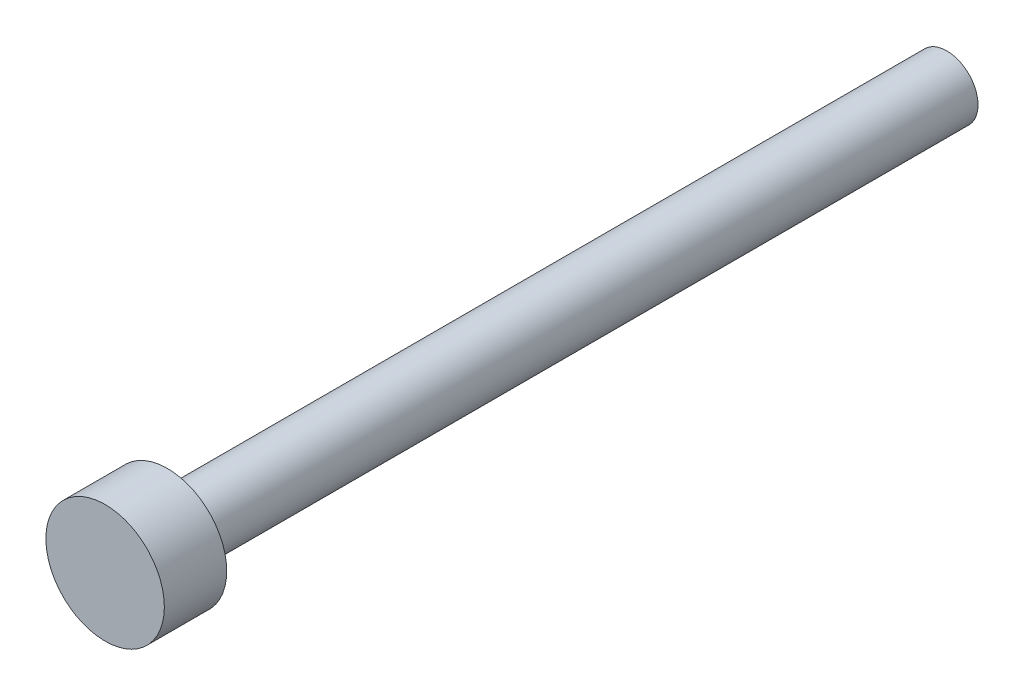
ISO-10303-21;
HEADER;
FILE_DESCRIPTION(('STEP AP214'),'2;1');
FILE_NAME('part.step','',(''),(''),'','','');
FILE_SCHEMA(('AUTOMOTIVE_DESIGN { 1 0 10303 214 1 1 1 1 }'));
ENDSEC;
DATA;
#1=APPLICATION_CONTEXT('core data for automotive mechanical design processes');
#2=APPLICATION_PROTOCOL_DEFINITION('international standard','automotive_design',2000,#1);
#3=PRODUCT_CONTEXT('',#1,'mechanical');
#4=PRODUCT('Part','Part','',(#3));
#5=PRODUCT_RELATED_PRODUCT_CATEGORY('part','',(#4));
#6=PRODUCT_DEFINITION_FORMATION('','',#4);
#7=PRODUCT_DEFINITION_CONTEXT('part definition',#1,'design');
#8=PRODUCT_DEFINITION('design','',#6,#7);
#9=PRODUCT_DEFINITION_SHAPE('','',#8);
#10=(LENGTH_UNIT() NAMED_UNIT(*) SI_UNIT(.MILLI.,.METRE.));
#11=(NAMED_UNIT(*) PLANE_ANGLE_UNIT() SI_UNIT($,.RADIAN.));
#12=(NAMED_UNIT(*) SI_UNIT($,.STERADIAN.) SOLID_ANGLE_UNIT());
#13=UNCERTAINTY_MEASURE_WITH_UNIT(LENGTH_MEASURE(1.E-05),#10,'distance_accuracy_value','');
#14=(GEOMETRIC_REPRESENTATION_CONTEXT(3) GLOBAL_UNCERTAINTY_ASSIGNED_CONTEXT((#13)) GLOBAL_UNIT_ASSIGNED_CONTEXT((#10,
#11,#12)) REPRESENTATION_CONTEXT('',''));
#15=CARTESIAN_POINT('',(0.,0.,0.));
#16=DIRECTION('',(0.,0.,1.));
#17=DIRECTION('',(1.,0.,0.));
#18=AXIS2_PLACEMENT_3D('',#15,#16,#17);
#19=CARTESIAN_POINT('',(0.,0.,0.));
#20=DIRECTION('',(0.,0.,-1.));
#21=DIRECTION('',(-1.,0.,0.));
#22=AXIS2_PLACEMENT_3D('',#19,#20,#21);
#23=CYLINDRICAL_SURFACE('',#22,1.);
#24=CARTESIAN_POINT('',(0.,0.,0.));
#25=DIRECTION('',(0.,0.,1.));
#26=DIRECTION('',(1.,0.,0.));
#27=AXIS2_PLACEMENT_3D('',#24,#25,#26);
#28=CIRCLE('',#27,1.);
#29=CARTESIAN_POINT('',(1.,0.,0.));
#30=VERTEX_POINT('',#29);
#31=EDGE_CURVE('E10',#30,#30,#28,.T.);
#32=ORIENTED_EDGE('',*,*,#31,.F.);
#33=EDGE_LOOP('',(#32));
#34=FACE_BOUND('',#33,.T.);
#35=CARTESIAN_POINT('',(0.,0.,-25.));
#36=DIRECTION('',(0.,0.,1.));
#37=DIRECTION('',(1.,0.,0.));
#38=AXIS2_PLACEMENT_3D('',#35,#36,#37);
#39=CIRCLE('',#38,1.);
#40=CARTESIAN_POINT('',(1.,0.,-25.));
#41=VERTEX_POINT('',#40);
#42=EDGE_CURVE('E37',#41,#41,#39,.T.);
#43=ORIENTED_EDGE('',*,*,#42,.T.);
#44=EDGE_LOOP('',(#43));
#45=FACE_BOUND('',#44,.T.);
#46=ADVANCED_FACE('F40',(#34,#45),#23,.T.);
#47=CARTESIAN_POINT('',(0.,0.,-25.));
#48=DIRECTION('',(0.,0.,1.));
#49=DIRECTION('',(1.,0.,0.));
#50=AXIS2_PLACEMENT_3D('',#47,#48,#49);
#51=PLANE('',#50);
#52=ORIENTED_EDGE('',*,*,#42,.F.);
#53=EDGE_LOOP('',(#52));
#54=FACE_BOUND('',#53,.T.);
#55=ADVANCED_FACE('F58',(#54),#51,.F.);
#56=CARTESIAN_POINT('',(0.,0.,2.));
#57=DIRECTION('',(0.,0.,-1.));
#58=DIRECTION('',(-1.,0.,0.));
#59=AXIS2_PLACEMENT_3D('',#56,#57,#58);
#60=CYLINDRICAL_SURFACE('',#59,1.9);
#61=CARTESIAN_POINT('',(0.,0.,2.));
#62=DIRECTION('',(0.,0.,1.));
#63=DIRECTION('',(1.,0.,0.));
#64=AXIS2_PLACEMENT_3D('',#61,#62,#63);
#65=CIRCLE('',#64,1.9);
#66=CARTESIAN_POINT('',(1.9,0.,2.));
#67=VERTEX_POINT('',#66);
#68=EDGE_CURVE('E50',#67,#67,#65,.T.);
#69=ORIENTED_EDGE('',*,*,#68,.F.);
#70=EDGE_LOOP('',(#69));
#71=FACE_BOUND('',#70,.T.);
#72=CARTESIAN_POINT('',(0.,0.,0.));
#73=DIRECTION('',(0.,0.,1.));
#74=DIRECTION('',(1.,0.,0.));
#75=AXIS2_PLACEMENT_3D('',#72,#73,#74);
#76=CIRCLE('',#75,1.9);
#77=CARTESIAN_POINT('',(1.9,0.,0.));
#78=VERTEX_POINT('',#77);
#79=EDGE_CURVE('E47',#78,#78,#76,.T.);
#80=ORIENTED_EDGE('',*,*,#79,.T.);
#81=EDGE_LOOP('',(#80));
#82=FACE_BOUND('',#81,.T.);
#83=ADVANCED_FACE('F60',(#71,#82),#60,.T.);
#84=CARTESIAN_POINT('',(0.,0.,2.));
#85=DIRECTION('',(0.,0.,1.));
#86=DIRECTION('',(1.,0.,0.));
#87=AXIS2_PLACEMENT_3D('',#84,#85,#86);
#88=PLANE('',#87);
#89=ORIENTED_EDGE('',*,*,#68,.T.);
#90=EDGE_LOOP('',(#89));
#91=FACE_BOUND('',#90,.T.);
#92=ADVANCED_FACE('F54',(#91),#88,.T.);
#93=CARTESIAN_POINT('',(0.,0.,0.));
#94=DIRECTION('',(0.,0.,1.));
#95=DIRECTION('',(1.,0.,0.));
#96=AXIS2_PLACEMENT_3D('',#93,#94,#95);
#97=PLANE('',#96);
#98=ORIENTED_EDGE('',*,*,#31,.T.);
#99=EDGE_LOOP('',(#98));
#100=FACE_BOUND('',#99,.T.);
#101=ORIENTED_EDGE('',*,*,#79,.F.);
#102=EDGE_LOOP('',(#101));
#103=FACE_BOUND('',#102,.T.);
#104=ADVANCED_FACE('F63',(#100,#103),#97,.F.);
#105=CLOSED_SHELL('',(#46,#55,#83,#92,#104));
#106=MANIFOLD_SOLID_BREP('B2',#105);
#107=ADVANCED_BREP_SHAPE_REPRESENTATION('',(#18,#106),#14);
#108=SHAPE_DEFINITION_REPRESENTATION(#9,#107);
ENDSEC;
END-ISO-10303-21;
